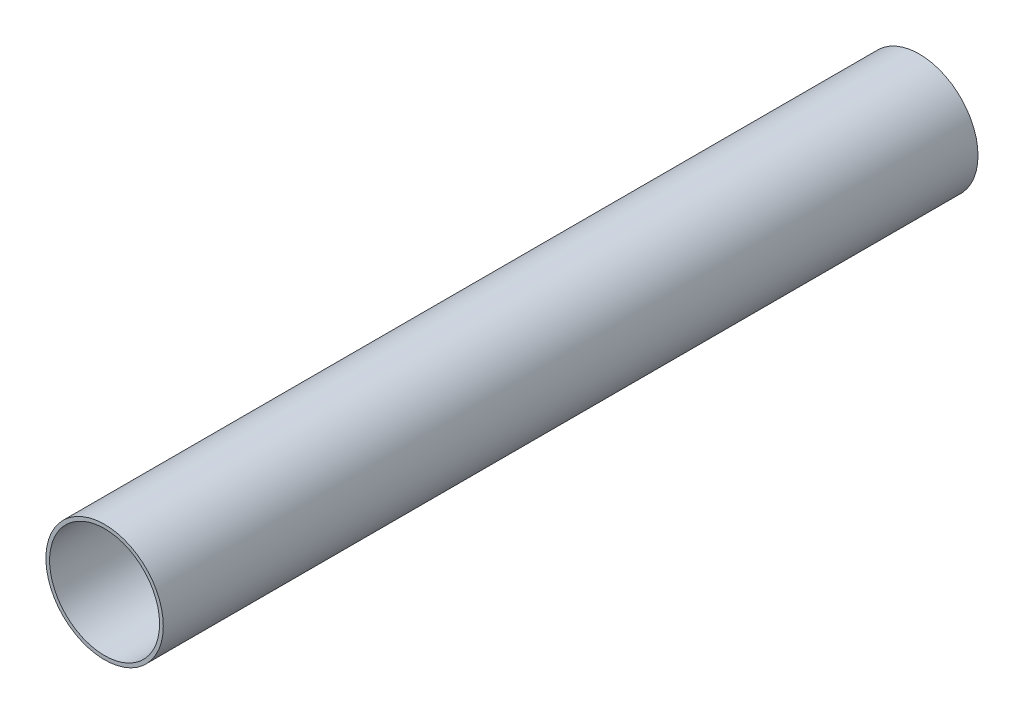
ISO-10303-21;
HEADER;
FILE_DESCRIPTION(('STEP AP214'),'2;1');
FILE_NAME('part.step','',(''),(''),'','','');
FILE_SCHEMA(('AUTOMOTIVE_DESIGN { 1 0 10303 214 1 1 1 1 }'));
ENDSEC;
DATA;
#1=APPLICATION_CONTEXT('core data for automotive mechanical design processes');
#2=APPLICATION_PROTOCOL_DEFINITION('international standard','automotive_design',2000,#1);
#3=PRODUCT_CONTEXT('',#1,'mechanical');
#4=PRODUCT('Part','Part','',(#3));
#5=PRODUCT_RELATED_PRODUCT_CATEGORY('part','',(#4));
#6=PRODUCT_DEFINITION_FORMATION('','',#4);
#7=PRODUCT_DEFINITION_CONTEXT('part definition',#1,'design');
#8=PRODUCT_DEFINITION('design','',#6,#7);
#9=PRODUCT_DEFINITION_SHAPE('','',#8);
#10=(LENGTH_UNIT() NAMED_UNIT(*) SI_UNIT(.MILLI.,.METRE.));
#11=(NAMED_UNIT(*) PLANE_ANGLE_UNIT() SI_UNIT($,.RADIAN.));
#12=(NAMED_UNIT(*) SI_UNIT($,.STERADIAN.) SOLID_ANGLE_UNIT());
#13=UNCERTAINTY_MEASURE_WITH_UNIT(LENGTH_MEASURE(1.E-05),#10,'distance_accuracy_value','');
#14=(GEOMETRIC_REPRESENTATION_CONTEXT(3) GLOBAL_UNCERTAINTY_ASSIGNED_CONTEXT((#13)) GLOBAL_UNIT_ASSIGNED_CONTEXT((#10,
#11,#12)) REPRESENTATION_CONTEXT('',''));
#15=CARTESIAN_POINT('',(0.,0.,0.));
#16=DIRECTION('',(0.,0.,1.));
#17=DIRECTION('',(1.,0.,0.));
#18=AXIS2_PLACEMENT_3D('',#15,#16,#17);
#19=CARTESIAN_POINT('',(0.,0.,220.));
#20=DIRECTION('',(0.,0.,-1.));
#21=DIRECTION('',(-1.,0.,0.));
#22=AXIS2_PLACEMENT_3D('',#19,#20,#21);
#23=CYLINDRICAL_SURFACE('',#22,15.85);
#24=CARTESIAN_POINT('',(0.,0.,220.));
#25=DIRECTION('',(0.,0.,1.));
#26=DIRECTION('',(1.,0.,0.));
#27=AXIS2_PLACEMENT_3D('',#24,#25,#26);
#28=CIRCLE('',#27,15.85);
#29=CARTESIAN_POINT('',(15.85,0.,220.));
#30=VERTEX_POINT('',#29);
#31=EDGE_CURVE('E10',#30,#30,#28,.T.);
#32=ORIENTED_EDGE('',*,*,#31,.F.);
#33=EDGE_LOOP('',(#32));
#34=FACE_BOUND('',#33,.T.);
#35=CARTESIAN_POINT('',(0.,0.,0.));
#36=DIRECTION('',(0.,0.,1.));
#37=DIRECTION('',(1.,0.,0.));
#38=AXIS2_PLACEMENT_3D('',#35,#36,#37);
#39=CIRCLE('',#38,15.85);
#40=CARTESIAN_POINT('',(15.85,0.,0.));
#41=VERTEX_POINT('',#40);
#42=EDGE_CURVE('E39',#41,#41,#39,.T.);
#43=ORIENTED_EDGE('',*,*,#42,.T.);
#44=EDGE_LOOP('',(#43));
#45=FACE_BOUND('',#44,.T.);
#46=ADVANCED_FACE('F36',(#34,#45),#23,.T.);
#47=CARTESIAN_POINT('',(0.,0.,220.));
#48=DIRECTION('',(0.,0.,1.));
#49=DIRECTION('',(1.,0.,0.));
#50=AXIS2_PLACEMENT_3D('',#47,#48,#49);
#51=PLANE('',#50);
#52=CARTESIAN_POINT('',(0.,0.,220.));
#53=DIRECTION('',(0.,0.,1.));
#54=DIRECTION('',(1.,0.,0.));
#55=AXIS2_PLACEMENT_3D('',#52,#53,#54);
#56=CIRCLE('',#55,14.85);
#57=CARTESIAN_POINT('',(14.85,0.,220.));
#58=VERTEX_POINT('',#57);
#59=EDGE_CURVE('E48',#58,#58,#56,.T.);
#60=ORIENTED_EDGE('',*,*,#59,.F.);
#61=EDGE_LOOP('',(#60));
#62=FACE_BOUND('',#61,.T.);
#63=ORIENTED_EDGE('',*,*,#31,.T.);
#64=EDGE_LOOP('',(#63));
#65=FACE_BOUND('',#64,.T.);
#66=ADVANCED_FACE('F61',(#62,#65),#51,.T.);
#67=CARTESIAN_POINT('',(0.,0.,0.));
#68=DIRECTION('',(0.,0.,1.));
#69=DIRECTION('',(1.,0.,0.));
#70=AXIS2_PLACEMENT_3D('',#67,#68,#69);
#71=PLANE('',#70);
#72=CARTESIAN_POINT('',(0.,0.,0.));
#73=DIRECTION('',(0.,0.,1.));
#74=DIRECTION('',(1.,0.,0.));
#75=AXIS2_PLACEMENT_3D('',#72,#73,#74);
#76=CIRCLE('',#75,14.85);
#77=CARTESIAN_POINT('',(14.85,0.,0.));
#78=VERTEX_POINT('',#77);
#79=EDGE_CURVE('E50',#78,#78,#76,.T.);
#80=ORIENTED_EDGE('',*,*,#79,.T.);
#81=EDGE_LOOP('',(#80));
#82=FACE_BOUND('',#81,.T.);
#83=ORIENTED_EDGE('',*,*,#42,.F.);
#84=EDGE_LOOP('',(#83));
#85=FACE_BOUND('',#84,.T.);
#86=ADVANCED_FACE('F63',(#82,#85),#71,.F.);
#87=CARTESIAN_POINT('',(0.,0.,220.));
#88=DIRECTION('',(0.,0.,-1.));
#89=DIRECTION('',(-1.,0.,0.));
#90=AXIS2_PLACEMENT_3D('',#87,#88,#89);
#91=CYLINDRICAL_SURFACE('',#90,14.85);
#92=ORIENTED_EDGE('',*,*,#59,.T.);
#93=EDGE_LOOP('',(#92));
#94=FACE_BOUND('',#93,.T.);
#95=ORIENTED_EDGE('',*,*,#79,.F.);
#96=EDGE_LOOP('',(#95));
#97=FACE_BOUND('',#96,.T.);
#98=ADVANCED_FACE('F58',(#94,#97),#91,.F.);
#99=CLOSED_SHELL('',(#46,#66,#86,#98));
#100=MANIFOLD_SOLID_BREP('B2',#99);
#101=ADVANCED_BREP_SHAPE_REPRESENTATION('',(#18,#100),#14);
#102=SHAPE_DEFINITION_REPRESENTATION(#9,#101);
ENDSEC;
END-ISO-10303-21;
